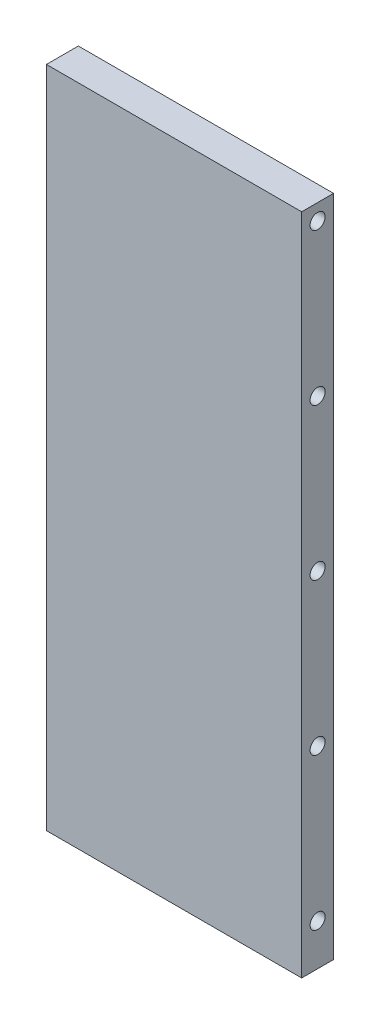
ISO-10303-21;
HEADER;
FILE_DESCRIPTION(('STEP AP214'),'2;1');
FILE_NAME('part.step','',(''),(''),'','','');
FILE_SCHEMA(('AUTOMOTIVE_DESIGN { 1 0 10303 214 1 1 1 1 }'));
ENDSEC;
DATA;
#1=APPLICATION_CONTEXT('core data for automotive mechanical design processes');
#2=APPLICATION_PROTOCOL_DEFINITION('international standard','automotive_design',2000,#1);
#3=PRODUCT_CONTEXT('',#1,'mechanical');
#4=PRODUCT('Part','Part','',(#3));
#5=PRODUCT_RELATED_PRODUCT_CATEGORY('part','',(#4));
#6=PRODUCT_DEFINITION_FORMATION('','',#4);
#7=PRODUCT_DEFINITION_CONTEXT('part definition',#1,'design');
#8=PRODUCT_DEFINITION('design','',#6,#7);
#9=PRODUCT_DEFINITION_SHAPE('','',#8);
#10=(LENGTH_UNIT() NAMED_UNIT(*) SI_UNIT(.MILLI.,.METRE.));
#11=(NAMED_UNIT(*) PLANE_ANGLE_UNIT() SI_UNIT($,.RADIAN.));
#12=(NAMED_UNIT(*) SI_UNIT($,.STERADIAN.) SOLID_ANGLE_UNIT());
#13=UNCERTAINTY_MEASURE_WITH_UNIT(LENGTH_MEASURE(1.E-05),#10,'distance_accuracy_value','');
#14=(GEOMETRIC_REPRESENTATION_CONTEXT(3) GLOBAL_UNCERTAINTY_ASSIGNED_CONTEXT((#13)) GLOBAL_UNIT_ASSIGNED_CONTEXT((#10,
#11,#12)) REPRESENTATION_CONTEXT('',''));
#15=CARTESIAN_POINT('',(0.,0.,0.));
#16=DIRECTION('',(0.,0.,1.));
#17=DIRECTION('',(1.,0.,0.));
#18=AXIS2_PLACEMENT_3D('',#15,#16,#17);
#19=CARTESIAN_POINT('',(0.,0.,10.));
#20=DIRECTION('',(1.,0.,0.));
#21=DIRECTION('',(0.,1.,0.));
#22=AXIS2_PLACEMENT_3D('',#19,#20,#21);
#23=PLANE('',#22);
#24=CARTESIAN_POINT('',(0.,195.,5.));
#25=DIRECTION('',(-1.,0.,0.));
#26=DIRECTION('',(0.,-1.,0.));
#27=AXIS2_PLACEMENT_3D('',#24,#25,#26);
#28=CIRCLE('',#27,2.35);
#29=CARTESIAN_POINT('',(0.,192.65,5.));
#30=VERTEX_POINT('',#29);
#31=EDGE_CURVE('E161',#30,#30,#28,.T.);
#32=ORIENTED_EDGE('',*,*,#31,.F.);
#33=EDGE_LOOP('',(#32));
#34=FACE_BOUND('',#33,.T.);
#35=CARTESIAN_POINT('',(0.,147.5,5.00000000000049));
#36=DIRECTION('',(-1.,0.,0.));
#37=DIRECTION('',(0.,-1.,0.));
#38=AXIS2_PLACEMENT_3D('',#35,#36,#37);
#39=CIRCLE('',#38,2.35);
#40=CARTESIAN_POINT('',(0.,145.15,5.00000000000049));
#41=VERTEX_POINT('',#40);
#42=EDGE_CURVE('E165',#41,#41,#39,.T.);
#43=ORIENTED_EDGE('',*,*,#42,.F.);
#44=EDGE_LOOP('',(#43));
#45=FACE_BOUND('',#44,.T.);
#46=CARTESIAN_POINT('',(0.,100.,5.00000000000099));
#47=DIRECTION('',(-1.,0.,0.));
#48=DIRECTION('',(0.,-1.,0.));
#49=AXIS2_PLACEMENT_3D('',#46,#47,#48);
#50=CIRCLE('',#49,2.35);
#51=CARTESIAN_POINT('',(0.,97.65,5.00000000000099));
#52=VERTEX_POINT('',#51);
#53=EDGE_CURVE('E173',#52,#52,#50,.T.);
#54=ORIENTED_EDGE('',*,*,#53,.F.);
#55=EDGE_LOOP('',(#54));
#56=FACE_BOUND('',#55,.T.);
#57=CARTESIAN_POINT('',(0.,52.5,5.00000000000148));
#58=DIRECTION('',(-1.,0.,0.));
#59=DIRECTION('',(0.,-1.,0.));
#60=AXIS2_PLACEMENT_3D('',#57,#58,#59);
#61=CIRCLE('',#60,2.35);
#62=CARTESIAN_POINT('',(0.,50.15,5.00000000000148));
#63=VERTEX_POINT('',#62);
#64=EDGE_CURVE('E181',#63,#63,#61,.T.);
#65=ORIENTED_EDGE('',*,*,#64,.F.);
#66=EDGE_LOOP('',(#65));
#67=FACE_BOUND('',#66,.T.);
#68=CARTESIAN_POINT('',(0.,5.,5.00000000000198));
#69=DIRECTION('',(-1.,0.,0.));
#70=DIRECTION('',(0.,-1.,0.));
#71=AXIS2_PLACEMENT_3D('',#68,#69,#70);
#72=CIRCLE('',#71,2.35);
#73=CARTESIAN_POINT('',(0.,2.65,5.00000000000198));
#74=VERTEX_POINT('',#73);
#75=EDGE_CURVE('E189',#74,#74,#72,.T.);
#76=ORIENTED_EDGE('',*,*,#75,.F.);
#77=EDGE_LOOP('',(#76));
#78=FACE_BOUND('',#77,.T.);
#79=DIRECTION('',(0.,-1.,0.));
#80=VECTOR('',#79,1.);
#81=CARTESIAN_POINT('',(0.,0.,0.));
#82=LINE('',#81,#80);
#83=CARTESIAN_POINT('',(0.,200.,0.));
#84=VERTEX_POINT('',#83);
#85=CARTESIAN_POINT('',(0.,-8.,0.));
#86=VERTEX_POINT('',#85);
#87=EDGE_CURVE('E90',#84,#86,#82,.T.);
#88=ORIENTED_EDGE('',*,*,#87,.T.);
#89=DIRECTION('',(0.,0.,-1.));
#90=VECTOR('',#89,1.);
#91=CARTESIAN_POINT('',(0.,-8.,10.));
#92=LINE('',#91,#90);
#93=CARTESIAN_POINT('',(0.,-8.,10.));
#94=VERTEX_POINT('',#93);
#95=EDGE_CURVE('E92',#94,#86,#92,.T.);
#96=ORIENTED_EDGE('',*,*,#95,.F.);
#97=DIRECTION('',(0.,-1.,0.));
#98=VECTOR('',#97,1.);
#99=CARTESIAN_POINT('',(0.,0.,10.));
#100=LINE('',#99,#98);
#101=CARTESIAN_POINT('',(0.,200.,10.));
#102=VERTEX_POINT('',#101);
#103=EDGE_CURVE('E79',#102,#94,#100,.T.);
#104=ORIENTED_EDGE('',*,*,#103,.F.);
#105=DIRECTION('',(0.,0.,-1.));
#106=VECTOR('',#105,1.);
#107=CARTESIAN_POINT('',(0.,200.,10.));
#108=LINE('',#107,#106);
#109=EDGE_CURVE('E54',#102,#84,#108,.T.);
#110=ORIENTED_EDGE('',*,*,#109,.T.);
#111=EDGE_LOOP('',(#88,#96,#104,#110));
#112=FACE_BOUND('',#111,.T.);
#113=ADVANCED_FACE('F45',(#34,#45,#56,#67,#78,#112),#23,.F.);
#114=CARTESIAN_POINT('',(80.,0.,10.));
#115=DIRECTION('',(-1.,0.,0.));
#116=DIRECTION('',(0.,-1.,0.));
#117=AXIS2_PLACEMENT_3D('',#114,#115,#116);
#118=PLANE('',#117);
#119=CARTESIAN_POINT('',(80.,195.,5.));
#120=DIRECTION('',(1.,0.,0.));
#121=DIRECTION('',(0.,1.,0.));
#122=AXIS2_PLACEMENT_3D('',#119,#120,#121);
#123=CIRCLE('',#122,2.35);
#124=CARTESIAN_POINT('',(80.,197.35,5.));
#125=VERTEX_POINT('',#124);
#126=EDGE_CURVE('E123',#125,#125,#123,.T.);
#127=ORIENTED_EDGE('',*,*,#126,.F.);
#128=EDGE_LOOP('',(#127));
#129=FACE_BOUND('',#128,.T.);
#130=CARTESIAN_POINT('',(80.,147.5,5.00000000000049));
#131=DIRECTION('',(1.,0.,0.));
#132=DIRECTION('',(0.,1.,0.));
#133=AXIS2_PLACEMENT_3D('',#130,#131,#132);
#134=CIRCLE('',#133,2.35);
#135=CARTESIAN_POINT('',(80.,149.85,5.00000000000049));
#136=VERTEX_POINT('',#135);
#137=EDGE_CURVE('E127',#136,#136,#134,.T.);
#138=ORIENTED_EDGE('',*,*,#137,.F.);
#139=EDGE_LOOP('',(#138));
#140=FACE_BOUND('',#139,.T.);
#141=CARTESIAN_POINT('',(80.,100.,5.00000000000099));
#142=DIRECTION('',(1.,0.,0.));
#143=DIRECTION('',(0.,1.,0.));
#144=AXIS2_PLACEMENT_3D('',#141,#142,#143);
#145=CIRCLE('',#144,2.35);
#146=CARTESIAN_POINT('',(80.,102.35,5.00000000000099));
#147=VERTEX_POINT('',#146);
#148=EDGE_CURVE('E135',#147,#147,#145,.T.);
#149=ORIENTED_EDGE('',*,*,#148,.F.);
#150=EDGE_LOOP('',(#149));
#151=FACE_BOUND('',#150,.T.);
#152=CARTESIAN_POINT('',(80.,52.5,5.00000000000148));
#153=DIRECTION('',(1.,0.,0.));
#154=DIRECTION('',(0.,1.,0.));
#155=AXIS2_PLACEMENT_3D('',#152,#153,#154);
#156=CIRCLE('',#155,2.35);
#157=CARTESIAN_POINT('',(80.,54.85,5.00000000000148));
#158=VERTEX_POINT('',#157);
#159=EDGE_CURVE('E143',#158,#158,#156,.T.);
#160=ORIENTED_EDGE('',*,*,#159,.F.);
#161=EDGE_LOOP('',(#160));
#162=FACE_BOUND('',#161,.T.);
#163=CARTESIAN_POINT('',(80.,5.00000000000002,5.00000000000198));
#164=DIRECTION('',(1.,0.,0.));
#165=DIRECTION('',(0.,1.,0.));
#166=AXIS2_PLACEMENT_3D('',#163,#164,#165);
#167=CIRCLE('',#166,2.35);
#168=CARTESIAN_POINT('',(80.,7.35000000000002,5.00000000000198));
#169=VERTEX_POINT('',#168);
#170=EDGE_CURVE('E151',#169,#169,#167,.T.);
#171=ORIENTED_EDGE('',*,*,#170,.F.);
#172=EDGE_LOOP('',(#171));
#173=FACE_BOUND('',#172,.T.);
#174=DIRECTION('',(0.,1.,0.));
#175=VECTOR('',#174,1.);
#176=CARTESIAN_POINT('',(80.,0.,0.));
#177=LINE('',#176,#175);
#178=CARTESIAN_POINT('',(80.,-8.00000000000001,0.));
#179=VERTEX_POINT('',#178);
#180=CARTESIAN_POINT('',(80.,200.,0.));
#181=VERTEX_POINT('',#180);
#182=EDGE_CURVE('E73',#179,#181,#177,.T.);
#183=ORIENTED_EDGE('',*,*,#182,.T.);
#184=DIRECTION('',(0.,0.,-1.));
#185=VECTOR('',#184,1.);
#186=CARTESIAN_POINT('',(80.,200.,10.));
#187=LINE('',#186,#185);
#188=CARTESIAN_POINT('',(80.,200.,10.));
#189=VERTEX_POINT('',#188);
#190=EDGE_CURVE('E11',#189,#181,#187,.T.);
#191=ORIENTED_EDGE('',*,*,#190,.F.);
#192=DIRECTION('',(0.,1.,0.));
#193=VECTOR('',#192,1.);
#194=CARTESIAN_POINT('',(80.,0.,10.));
#195=LINE('',#194,#193);
#196=CARTESIAN_POINT('',(80.,-8.00000000000001,10.));
#197=VERTEX_POINT('',#196);
#198=EDGE_CURVE('E198',#197,#189,#195,.T.);
#199=ORIENTED_EDGE('',*,*,#198,.F.);
#200=DIRECTION('',(0.,0.,-1.));
#201=VECTOR('',#200,1.);
#202=CARTESIAN_POINT('',(80.,-8.00000000000001,10.));
#203=LINE('',#202,#201);
#204=EDGE_CURVE('E108',#197,#179,#203,.T.);
#205=ORIENTED_EDGE('',*,*,#204,.T.);
#206=EDGE_LOOP('',(#183,#191,#199,#205));
#207=FACE_BOUND('',#206,.T.);
#208=ADVANCED_FACE('F210',(#129,#140,#151,#162,#173,#207),#118,.F.);
#209=CARTESIAN_POINT('',(0.,200.,10.));
#210=DIRECTION('',(0.,-1.,0.));
#211=DIRECTION('',(0.,0.,-1.));
#212=AXIS2_PLACEMENT_3D('',#209,#210,#211);
#213=PLANE('',#212);
#214=DIRECTION('',(-1.,0.,0.));
#215=VECTOR('',#214,1.);
#216=CARTESIAN_POINT('',(0.,200.,0.));
#217=LINE('',#216,#215);
#218=EDGE_CURVE('E199',#181,#84,#217,.T.);
#219=ORIENTED_EDGE('',*,*,#218,.T.);
#220=ORIENTED_EDGE('',*,*,#109,.F.);
#221=DIRECTION('',(-1.,0.,0.));
#222=VECTOR('',#221,1.);
#223=CARTESIAN_POINT('',(0.,200.,10.));
#224=LINE('',#223,#222);
#225=EDGE_CURVE('E62',#189,#102,#224,.T.);
#226=ORIENTED_EDGE('',*,*,#225,.F.);
#227=ORIENTED_EDGE('',*,*,#190,.T.);
#228=EDGE_LOOP('',(#219,#220,#226,#227));
#229=FACE_BOUND('',#228,.T.);
#230=ADVANCED_FACE('F209',(#229),#213,.F.);
#231=CARTESIAN_POINT('',(0.,0.,10.));
#232=DIRECTION('',(0.,0.,-1.));
#233=DIRECTION('',(-1.,0.,0.));
#234=AXIS2_PLACEMENT_3D('',#231,#232,#233);
#235=PLANE('',#234);
#236=ORIENTED_EDGE('',*,*,#103,.T.);
#237=DIRECTION('',(-1.,0.,0.));
#238=VECTOR('',#237,1.);
#239=CARTESIAN_POINT('',(0.,-8.,10.));
#240=LINE('',#239,#238);
#241=EDGE_CURVE('E105',#197,#94,#240,.T.);
#242=ORIENTED_EDGE('',*,*,#241,.F.);
#243=ORIENTED_EDGE('',*,*,#198,.T.);
#244=ORIENTED_EDGE('',*,*,#225,.T.);
#245=EDGE_LOOP('',(#236,#242,#243,#244));
#246=FACE_BOUND('',#245,.T.);
#247=ADVANCED_FACE('F211',(#246),#235,.F.);
#248=CARTESIAN_POINT('',(0.,0.,0.));
#249=DIRECTION('',(0.,0.,-1.));
#250=DIRECTION('',(-1.,0.,0.));
#251=AXIS2_PLACEMENT_3D('',#248,#249,#250);
#252=PLANE('',#251);
#253=ORIENTED_EDGE('',*,*,#87,.F.);
#254=ORIENTED_EDGE('',*,*,#218,.F.);
#255=ORIENTED_EDGE('',*,*,#182,.F.);
#256=DIRECTION('',(-1.,0.,0.));
#257=VECTOR('',#256,1.);
#258=CARTESIAN_POINT('',(0.,-8.,0.));
#259=LINE('',#258,#257);
#260=EDGE_CURVE('E104',#179,#86,#259,.T.);
#261=ORIENTED_EDGE('',*,*,#260,.T.);
#262=EDGE_LOOP('',(#253,#254,#255,#261));
#263=FACE_BOUND('',#262,.T.);
#264=ADVANCED_FACE('F110',(#263),#252,.T.);
#265=CARTESIAN_POINT('',(5.,5.00000000000001,5.00000000000198));
#266=DIRECTION('',(-1.,0.,0.));
#267=DIRECTION('',(0.,-1.,0.));
#268=AXIS2_PLACEMENT_3D('',#265,#266,#267);
#269=CYLINDRICAL_SURFACE('',#268,2.35);
#270=CARTESIAN_POINT('',(5.,5.00000000000001,5.00000000000198));
#271=DIRECTION('',(-1.,0.,0.));
#272=DIRECTION('',(0.,-1.,0.));
#273=AXIS2_PLACEMENT_3D('',#270,#271,#272);
#274=CIRCLE('',#273,2.35);
#275=CARTESIAN_POINT('',(5.,2.65,5.00000000000198));
#276=VERTEX_POINT('',#275);
#277=EDGE_CURVE('E122',#276,#276,#274,.T.);
#278=ORIENTED_EDGE('',*,*,#277,.F.);
#279=EDGE_LOOP('',(#278));
#280=FACE_BOUND('',#279,.T.);
#281=ORIENTED_EDGE('',*,*,#75,.T.);
#282=EDGE_LOOP('',(#281));
#283=FACE_BOUND('',#282,.T.);
#284=ADVANCED_FACE('F218',(#280,#283),#269,.F.);
#285=CARTESIAN_POINT('',(5.,5.00000000000001,5.00000000000198));
#286=DIRECTION('',(-1.,0.,0.));
#287=DIRECTION('',(0.,-1.,0.));
#288=AXIS2_PLACEMENT_3D('',#285,#286,#287);
#289=PLANE('',#288);
#290=ORIENTED_EDGE('',*,*,#277,.T.);
#291=EDGE_LOOP('',(#290));
#292=FACE_BOUND('',#291,.T.);
#293=ADVANCED_FACE('F240',(#292),#289,.T.);
#294=CARTESIAN_POINT('',(4.99999999999999,52.5,5.00000000000148));
#295=DIRECTION('',(-1.,0.,0.));
#296=DIRECTION('',(0.,-1.,0.));
#297=AXIS2_PLACEMENT_3D('',#294,#295,#296);
#298=CYLINDRICAL_SURFACE('',#297,2.35);
#299=CARTESIAN_POINT('',(4.99999999999999,52.5,5.00000000000148));
#300=DIRECTION('',(-1.,0.,0.));
#301=DIRECTION('',(0.,-1.,0.));
#302=AXIS2_PLACEMENT_3D('',#299,#300,#301);
#303=CIRCLE('',#302,2.35);
#304=CARTESIAN_POINT('',(4.99999999999999,50.15,5.00000000000148));
#305=VERTEX_POINT('',#304);
#306=EDGE_CURVE('E185',#305,#305,#303,.T.);
#307=ORIENTED_EDGE('',*,*,#306,.F.);
#308=EDGE_LOOP('',(#307));
#309=FACE_BOUND('',#308,.T.);
#310=ORIENTED_EDGE('',*,*,#64,.T.);
#311=EDGE_LOOP('',(#310));
#312=FACE_BOUND('',#311,.T.);
#313=ADVANCED_FACE('F246',(#309,#312),#298,.F.);
#314=CARTESIAN_POINT('',(4.99999999999999,52.5,5.00000000000148));
#315=DIRECTION('',(-1.,0.,0.));
#316=DIRECTION('',(0.,-1.,0.));
#317=AXIS2_PLACEMENT_3D('',#314,#315,#316);
#318=PLANE('',#317);
#319=ORIENTED_EDGE('',*,*,#306,.T.);
#320=EDGE_LOOP('',(#319));
#321=FACE_BOUND('',#320,.T.);
#322=ADVANCED_FACE('F250',(#321),#318,.T.);
#323=CARTESIAN_POINT('',(4.99999999999998,100.,5.00000000000099));
#324=DIRECTION('',(-1.,0.,0.));
#325=DIRECTION('',(0.,-1.,0.));
#326=AXIS2_PLACEMENT_3D('',#323,#324,#325);
#327=CYLINDRICAL_SURFACE('',#326,2.35);
#328=CARTESIAN_POINT('',(4.99999999999998,100.,5.00000000000099));
#329=DIRECTION('',(-1.,0.,0.));
#330=DIRECTION('',(0.,-1.,0.));
#331=AXIS2_PLACEMENT_3D('',#328,#329,#330);
#332=CIRCLE('',#331,2.35);
#333=CARTESIAN_POINT('',(4.99999999999998,97.65,5.00000000000099));
#334=VERTEX_POINT('',#333);
#335=EDGE_CURVE('E177',#334,#334,#332,.T.);
#336=ORIENTED_EDGE('',*,*,#335,.F.);
#337=EDGE_LOOP('',(#336));
#338=FACE_BOUND('',#337,.T.);
#339=ORIENTED_EDGE('',*,*,#53,.T.);
#340=EDGE_LOOP('',(#339));
#341=FACE_BOUND('',#340,.T.);
#342=ADVANCED_FACE('F253',(#338,#341),#327,.F.);
#343=CARTESIAN_POINT('',(4.99999999999998,100.,5.00000000000099));
#344=DIRECTION('',(-1.,0.,0.));
#345=DIRECTION('',(0.,-1.,0.));
#346=AXIS2_PLACEMENT_3D('',#343,#344,#345);
#347=PLANE('',#346);
#348=ORIENTED_EDGE('',*,*,#335,.T.);
#349=EDGE_LOOP('',(#348));
#350=FACE_BOUND('',#349,.T.);
#351=ADVANCED_FACE('F258',(#350),#347,.T.);
#352=CARTESIAN_POINT('',(4.99999999999997,147.5,5.00000000000049));
#353=DIRECTION('',(-1.,0.,0.));
#354=DIRECTION('',(0.,-1.,0.));
#355=AXIS2_PLACEMENT_3D('',#352,#353,#354);
#356=CYLINDRICAL_SURFACE('',#355,2.35);
#357=CARTESIAN_POINT('',(4.99999999999997,147.5,5.00000000000049));
#358=DIRECTION('',(-1.,0.,0.));
#359=DIRECTION('',(0.,-1.,0.));
#360=AXIS2_PLACEMENT_3D('',#357,#358,#359);
#361=CIRCLE('',#360,2.35);
#362=CARTESIAN_POINT('',(4.99999999999997,145.15,5.00000000000049));
#363=VERTEX_POINT('',#362);
#364=EDGE_CURVE('E169',#363,#363,#361,.T.);
#365=ORIENTED_EDGE('',*,*,#364,.F.);
#366=EDGE_LOOP('',(#365));
#367=FACE_BOUND('',#366,.T.);
#368=ORIENTED_EDGE('',*,*,#42,.T.);
#369=EDGE_LOOP('',(#368));
#370=FACE_BOUND('',#369,.T.);
#371=ADVANCED_FACE('F261',(#367,#370),#356,.F.);
#372=CARTESIAN_POINT('',(4.99999999999997,147.5,5.00000000000049));
#373=DIRECTION('',(-1.,0.,0.));
#374=DIRECTION('',(0.,-1.,0.));
#375=AXIS2_PLACEMENT_3D('',#372,#373,#374);
#376=PLANE('',#375);
#377=ORIENTED_EDGE('',*,*,#364,.T.);
#378=EDGE_LOOP('',(#377));
#379=FACE_BOUND('',#378,.T.);
#380=ADVANCED_FACE('F266',(#379),#376,.T.);
#381=CARTESIAN_POINT('',(4.99999999999997,195.,5.));
#382=DIRECTION('',(-1.,0.,0.));
#383=DIRECTION('',(0.,-1.,0.));
#384=AXIS2_PLACEMENT_3D('',#381,#382,#383);
#385=CYLINDRICAL_SURFACE('',#384,2.35);
#386=CARTESIAN_POINT('',(4.99999999999997,195.,5.));
#387=DIRECTION('',(-1.,0.,0.));
#388=DIRECTION('',(0.,-1.,0.));
#389=AXIS2_PLACEMENT_3D('',#386,#387,#388);
#390=CIRCLE('',#389,2.35);
#391=CARTESIAN_POINT('',(4.99999999999997,192.65,5.));
#392=VERTEX_POINT('',#391);
#393=EDGE_CURVE('E98',#392,#392,#390,.T.);
#394=ORIENTED_EDGE('',*,*,#393,.F.);
#395=EDGE_LOOP('',(#394));
#396=FACE_BOUND('',#395,.T.);
#397=ORIENTED_EDGE('',*,*,#31,.T.);
#398=EDGE_LOOP('',(#397));
#399=FACE_BOUND('',#398,.T.);
#400=ADVANCED_FACE('F269',(#396,#399),#385,.F.);
#401=CARTESIAN_POINT('',(4.99999999999997,195.,5.));
#402=DIRECTION('',(-1.,0.,0.));
#403=DIRECTION('',(0.,-1.,0.));
#404=AXIS2_PLACEMENT_3D('',#401,#402,#403);
#405=PLANE('',#404);
#406=ORIENTED_EDGE('',*,*,#393,.T.);
#407=EDGE_LOOP('',(#406));
#408=FACE_BOUND('',#407,.T.);
#409=ADVANCED_FACE('F276',(#408),#405,.T.);
#410=CARTESIAN_POINT('',(75.,5.00000000000002,5.00000000000198));
#411=DIRECTION('',(1.,0.,0.));
#412=DIRECTION('',(0.,1.,0.));
#413=AXIS2_PLACEMENT_3D('',#410,#411,#412);
#414=CYLINDRICAL_SURFACE('',#413,2.35);
#415=CARTESIAN_POINT('',(75.,5.00000000000002,5.00000000000198));
#416=DIRECTION('',(1.,0.,0.));
#417=DIRECTION('',(0.,1.,0.));
#418=AXIS2_PLACEMENT_3D('',#415,#416,#417);
#419=CIRCLE('',#418,2.35);
#420=CARTESIAN_POINT('',(75.,7.35000000000002,5.00000000000198));
#421=VERTEX_POINT('',#420);
#422=EDGE_CURVE('E107',#421,#421,#419,.T.);
#423=ORIENTED_EDGE('',*,*,#422,.F.);
#424=EDGE_LOOP('',(#423));
#425=FACE_BOUND('',#424,.T.);
#426=ORIENTED_EDGE('',*,*,#170,.T.);
#427=EDGE_LOOP('',(#426));
#428=FACE_BOUND('',#427,.T.);
#429=ADVANCED_FACE('F280',(#425,#428),#414,.F.);
#430=CARTESIAN_POINT('',(75.,5.00000000000002,5.00000000000198));
#431=DIRECTION('',(1.,0.,0.));
#432=DIRECTION('',(0.,1.,0.));
#433=AXIS2_PLACEMENT_3D('',#430,#431,#432);
#434=PLANE('',#433);
#435=ORIENTED_EDGE('',*,*,#422,.T.);
#436=EDGE_LOOP('',(#435));
#437=FACE_BOUND('',#436,.T.);
#438=ADVANCED_FACE('F282',(#437),#434,.T.);
#439=CARTESIAN_POINT('',(75.,52.5,5.00000000000148));
#440=DIRECTION('',(1.,0.,0.));
#441=DIRECTION('',(0.,1.,0.));
#442=AXIS2_PLACEMENT_3D('',#439,#440,#441);
#443=CYLINDRICAL_SURFACE('',#442,2.35);
#444=CARTESIAN_POINT('',(75.,52.5,5.00000000000148));
#445=DIRECTION('',(1.,0.,0.));
#446=DIRECTION('',(0.,1.,0.));
#447=AXIS2_PLACEMENT_3D('',#444,#445,#446);
#448=CIRCLE('',#447,2.35);
#449=CARTESIAN_POINT('',(75.,54.85,5.00000000000148));
#450=VERTEX_POINT('',#449);
#451=EDGE_CURVE('E147',#450,#450,#448,.T.);
#452=ORIENTED_EDGE('',*,*,#451,.F.);
#453=EDGE_LOOP('',(#452));
#454=FACE_BOUND('',#453,.T.);
#455=ORIENTED_EDGE('',*,*,#159,.T.);
#456=EDGE_LOOP('',(#455));
#457=FACE_BOUND('',#456,.T.);
#458=ADVANCED_FACE('F285',(#454,#457),#443,.F.);
#459=CARTESIAN_POINT('',(75.,52.5,5.00000000000148));
#460=DIRECTION('',(1.,0.,0.));
#461=DIRECTION('',(0.,1.,0.));
#462=AXIS2_PLACEMENT_3D('',#459,#460,#461);
#463=PLANE('',#462);
#464=ORIENTED_EDGE('',*,*,#451,.T.);
#465=EDGE_LOOP('',(#464));
#466=FACE_BOUND('',#465,.T.);
#467=ADVANCED_FACE('F290',(#466),#463,.T.);
#468=CARTESIAN_POINT('',(75.,100.,5.00000000000099));
#469=DIRECTION('',(1.,0.,0.));
#470=DIRECTION('',(0.,1.,0.));
#471=AXIS2_PLACEMENT_3D('',#468,#469,#470);
#472=CYLINDRICAL_SURFACE('',#471,2.35);
#473=CARTESIAN_POINT('',(75.,100.,5.00000000000099));
#474=DIRECTION('',(1.,0.,0.));
#475=DIRECTION('',(0.,1.,0.));
#476=AXIS2_PLACEMENT_3D('',#473,#474,#475);
#477=CIRCLE('',#476,2.35);
#478=CARTESIAN_POINT('',(75.,102.35,5.00000000000099));
#479=VERTEX_POINT('',#478);
#480=EDGE_CURVE('E139',#479,#479,#477,.T.);
#481=ORIENTED_EDGE('',*,*,#480,.F.);
#482=EDGE_LOOP('',(#481));
#483=FACE_BOUND('',#482,.T.);
#484=ORIENTED_EDGE('',*,*,#148,.T.);
#485=EDGE_LOOP('',(#484));
#486=FACE_BOUND('',#485,.T.);
#487=ADVANCED_FACE('F293',(#483,#486),#472,.F.);
#488=CARTESIAN_POINT('',(75.,100.,5.00000000000099));
#489=DIRECTION('',(1.,0.,0.));
#490=DIRECTION('',(0.,1.,0.));
#491=AXIS2_PLACEMENT_3D('',#488,#489,#490);
#492=PLANE('',#491);
#493=ORIENTED_EDGE('',*,*,#480,.T.);
#494=EDGE_LOOP('',(#493));
#495=FACE_BOUND('',#494,.T.);
#496=ADVANCED_FACE('F298',(#495),#492,.T.);
#497=CARTESIAN_POINT('',(75.,147.5,5.00000000000049));
#498=DIRECTION('',(1.,0.,0.));
#499=DIRECTION('',(0.,1.,0.));
#500=AXIS2_PLACEMENT_3D('',#497,#498,#499);
#501=CYLINDRICAL_SURFACE('',#500,2.35);
#502=CARTESIAN_POINT('',(75.,147.5,5.00000000000049));
#503=DIRECTION('',(1.,0.,0.));
#504=DIRECTION('',(0.,1.,0.));
#505=AXIS2_PLACEMENT_3D('',#502,#503,#504);
#506=CIRCLE('',#505,2.35);
#507=CARTESIAN_POINT('',(75.,149.85,5.00000000000049));
#508=VERTEX_POINT('',#507);
#509=EDGE_CURVE('E131',#508,#508,#506,.T.);
#510=ORIENTED_EDGE('',*,*,#509,.F.);
#511=EDGE_LOOP('',(#510));
#512=FACE_BOUND('',#511,.T.);
#513=ORIENTED_EDGE('',*,*,#137,.T.);
#514=EDGE_LOOP('',(#513));
#515=FACE_BOUND('',#514,.T.);
#516=ADVANCED_FACE('F301',(#512,#515),#501,.F.);
#517=CARTESIAN_POINT('',(75.,147.5,5.00000000000049));
#518=DIRECTION('',(1.,0.,0.));
#519=DIRECTION('',(0.,1.,0.));
#520=AXIS2_PLACEMENT_3D('',#517,#518,#519);
#521=PLANE('',#520);
#522=ORIENTED_EDGE('',*,*,#509,.T.);
#523=EDGE_LOOP('',(#522));
#524=FACE_BOUND('',#523,.T.);
#525=ADVANCED_FACE('F306',(#524),#521,.T.);
#526=CARTESIAN_POINT('',(75.,195.,5.));
#527=DIRECTION('',(1.,0.,0.));
#528=DIRECTION('',(0.,1.,0.));
#529=AXIS2_PLACEMENT_3D('',#526,#527,#528);
#530=CYLINDRICAL_SURFACE('',#529,2.35);
#531=CARTESIAN_POINT('',(75.,195.,5.));
#532=DIRECTION('',(1.,0.,0.));
#533=DIRECTION('',(0.,1.,0.));
#534=AXIS2_PLACEMENT_3D('',#531,#532,#533);
#535=CIRCLE('',#534,2.35);
#536=CARTESIAN_POINT('',(75.,197.35,5.));
#537=VERTEX_POINT('',#536);
#538=EDGE_CURVE('E118',#537,#537,#535,.T.);
#539=ORIENTED_EDGE('',*,*,#538,.F.);
#540=EDGE_LOOP('',(#539));
#541=FACE_BOUND('',#540,.T.);
#542=ORIENTED_EDGE('',*,*,#126,.T.);
#543=EDGE_LOOP('',(#542));
#544=FACE_BOUND('',#543,.T.);
#545=ADVANCED_FACE('F309',(#541,#544),#530,.F.);
#546=CARTESIAN_POINT('',(75.,195.,5.));
#547=DIRECTION('',(1.,0.,0.));
#548=DIRECTION('',(0.,1.,0.));
#549=AXIS2_PLACEMENT_3D('',#546,#547,#548);
#550=PLANE('',#549);
#551=ORIENTED_EDGE('',*,*,#538,.T.);
#552=EDGE_LOOP('',(#551));
#553=FACE_BOUND('',#552,.T.);
#554=ADVANCED_FACE('F316',(#553),#550,.T.);
#555=CARTESIAN_POINT('',(0.,-8.,10.));
#556=DIRECTION('',(0.,-1.,0.));
#557=DIRECTION('',(1.,0.,0.));
#558=AXIS2_PLACEMENT_3D('',#555,#556,#557);
#559=PLANE('',#558);
#560=ORIENTED_EDGE('',*,*,#260,.F.);
#561=ORIENTED_EDGE('',*,*,#204,.F.);
#562=ORIENTED_EDGE('',*,*,#241,.T.);
#563=ORIENTED_EDGE('',*,*,#95,.T.);
#564=EDGE_LOOP('',(#560,#561,#562,#563));
#565=FACE_BOUND('',#564,.T.);
#566=ADVANCED_FACE('F102',(#565),#559,.T.);
#567=CLOSED_SHELL('',(#113,#208,#230,#247,#264,#284,#293,#313,#322,#342,#351,#371,#380,#400,
#409,#429,#438,#458,#467,#487,#496,#516,#525,#545,#554,#566));
#568=MANIFOLD_SOLID_BREP('B2',#567);
#569=ADVANCED_BREP_SHAPE_REPRESENTATION('',(#18,#568),#14);
#570=SHAPE_DEFINITION_REPRESENTATION(#9,#569);
ENDSEC;
END-ISO-10303-21;
